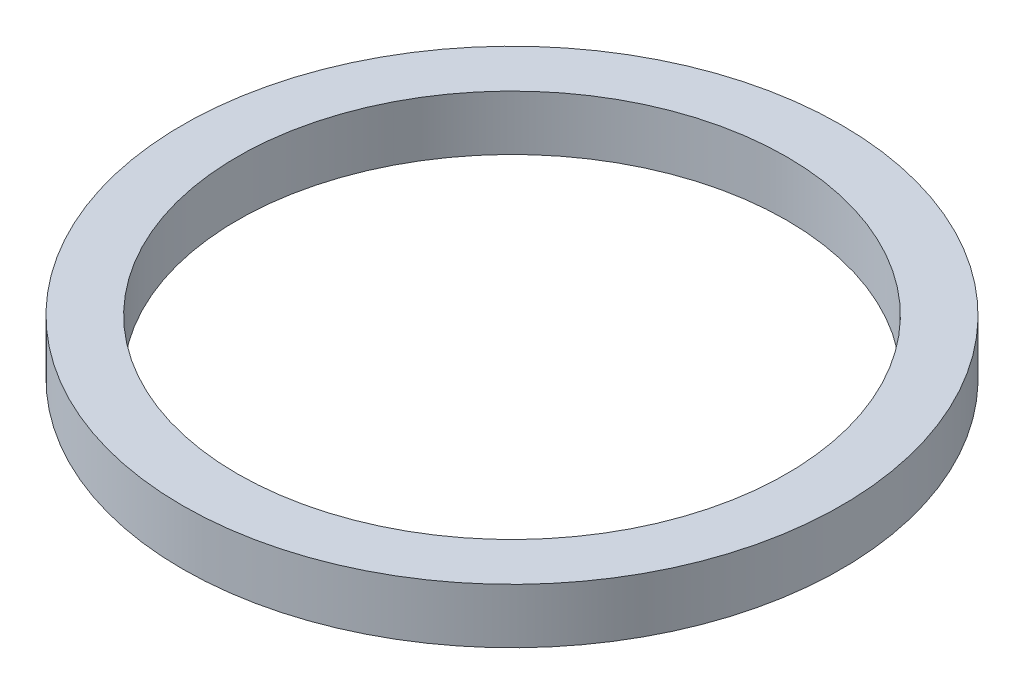
ISO-10303-21;
HEADER;
FILE_DESCRIPTION(('STEP AP214'),'2;1');
FILE_NAME('part.step','',(''),(''),'','','');
FILE_SCHEMA(('AUTOMOTIVE_DESIGN { 1 0 10303 214 1 1 1 1 }'));
ENDSEC;
DATA;
#1=APPLICATION_CONTEXT('core data for automotive mechanical design processes');
#2=APPLICATION_PROTOCOL_DEFINITION('international standard','automotive_design',2000,#1);
#3=PRODUCT_CONTEXT('',#1,'mechanical');
#4=PRODUCT('Part','Part','',(#3));
#5=PRODUCT_RELATED_PRODUCT_CATEGORY('part','',(#4));
#6=PRODUCT_DEFINITION_FORMATION('','',#4);
#7=PRODUCT_DEFINITION_CONTEXT('part definition',#1,'design');
#8=PRODUCT_DEFINITION('design','',#6,#7);
#9=PRODUCT_DEFINITION_SHAPE('','',#8);
#10=(LENGTH_UNIT() NAMED_UNIT(*) SI_UNIT(.MILLI.,.METRE.));
#11=(NAMED_UNIT(*) PLANE_ANGLE_UNIT() SI_UNIT($,.RADIAN.));
#12=(NAMED_UNIT(*) SI_UNIT($,.STERADIAN.) SOLID_ANGLE_UNIT());
#13=UNCERTAINTY_MEASURE_WITH_UNIT(LENGTH_MEASURE(1.E-05),#10,'distance_accuracy_value','');
#14=(GEOMETRIC_REPRESENTATION_CONTEXT(3) GLOBAL_UNCERTAINTY_ASSIGNED_CONTEXT((#13)) GLOBAL_UNIT_ASSIGNED_CONTEXT((#10,
#11,#12)) REPRESENTATION_CONTEXT('',''));
#15=CARTESIAN_POINT('',(0.,0.,0.));
#16=DIRECTION('',(0.,0.,1.));
#17=DIRECTION('',(1.,0.,0.));
#18=AXIS2_PLACEMENT_3D('',#15,#16,#17);
#19=CARTESIAN_POINT('',(-59.6665809094168,0.4,-25.7617495737929));
#20=DIRECTION('',(0.,1.,0.));
#21=DIRECTION('',(0.,0.,1.));
#22=AXIS2_PLACEMENT_3D('',#19,#20,#21);
#23=PLANE('',#22);
#24=CARTESIAN_POINT('',(-59.6665809094168,0.4,-25.7617495737929));
#25=DIRECTION('',(0.,1.,0.));
#26=DIRECTION('',(0.,0.,1.));
#27=AXIS2_PLACEMENT_3D('',#24,#25,#26);
#28=CIRCLE('',#27,2.4);
#29=CARTESIAN_POINT('',(-59.6665809094168,0.4,-23.3617495737929));
#30=VERTEX_POINT('',#29);
#31=EDGE_CURVE('E11',#30,#30,#28,.T.);
#32=ORIENTED_EDGE('',*,*,#31,.T.);
#33=EDGE_LOOP('',(#32));
#34=FACE_BOUND('',#33,.T.);
#35=CARTESIAN_POINT('',(-59.6665809094168,0.4,-25.7617495737929));
#36=DIRECTION('',(0.,1.,0.));
#37=DIRECTION('',(0.,0.,1.));
#38=AXIS2_PLACEMENT_3D('',#35,#36,#37);
#39=CIRCLE('',#38,2.);
#40=CARTESIAN_POINT('',(-59.6665809094168,0.4,-23.7617495737929));
#41=VERTEX_POINT('',#40);
#42=EDGE_CURVE('E56',#41,#41,#39,.T.);
#43=ORIENTED_EDGE('',*,*,#42,.F.);
#44=EDGE_LOOP('',(#43));
#45=FACE_BOUND('',#44,.T.);
#46=ADVANCED_FACE('F43',(#34,#45),#23,.T.);
#47=CARTESIAN_POINT('',(-59.6665809094168,0.,-25.7617495737929));
#48=DIRECTION('',(0.,1.,0.));
#49=DIRECTION('',(0.,0.,1.));
#50=AXIS2_PLACEMENT_3D('',#47,#48,#49);
#51=PLANE('',#50);
#52=CARTESIAN_POINT('',(-59.6665809094168,0.,-25.7617495737929));
#53=DIRECTION('',(0.,1.,0.));
#54=DIRECTION('',(0.,0.,1.));
#55=AXIS2_PLACEMENT_3D('',#52,#53,#54);
#56=CIRCLE('',#55,2.4);
#57=CARTESIAN_POINT('',(-59.6665809094168,0.,-23.3617495737929));
#58=VERTEX_POINT('',#57);
#59=EDGE_CURVE('E47',#58,#58,#56,.T.);
#60=ORIENTED_EDGE('',*,*,#59,.F.);
#61=EDGE_LOOP('',(#60));
#62=FACE_BOUND('',#61,.T.);
#63=CARTESIAN_POINT('',(-59.6665809094168,0.,-25.7617495737929));
#64=DIRECTION('',(0.,1.,0.));
#65=DIRECTION('',(0.,0.,1.));
#66=AXIS2_PLACEMENT_3D('',#63,#64,#65);
#67=CIRCLE('',#66,2.);
#68=CARTESIAN_POINT('',(-59.6665809094168,0.,-23.7617495737929));
#69=VERTEX_POINT('',#68);
#70=EDGE_CURVE('E58',#69,#69,#67,.T.);
#71=ORIENTED_EDGE('',*,*,#70,.T.);
#72=EDGE_LOOP('',(#71));
#73=FACE_BOUND('',#72,.T.);
#74=ADVANCED_FACE('F70',(#62,#73),#51,.F.);
#75=CARTESIAN_POINT('',(-59.6665809094168,0.4,-25.7617495737929));
#76=DIRECTION('',(0.,-1.,0.));
#77=DIRECTION('',(0.,0.,-1.));
#78=AXIS2_PLACEMENT_3D('',#75,#76,#77);
#79=CYLINDRICAL_SURFACE('',#78,2.4);
#80=ORIENTED_EDGE('',*,*,#31,.F.);
#81=EDGE_LOOP('',(#80));
#82=FACE_BOUND('',#81,.T.);
#83=ORIENTED_EDGE('',*,*,#59,.T.);
#84=EDGE_LOOP('',(#83));
#85=FACE_BOUND('',#84,.T.);
#86=ADVANCED_FACE('F45',(#82,#85),#79,.T.);
#87=CARTESIAN_POINT('',(-59.6665809094168,0.4,-25.7617495737929));
#88=DIRECTION('',(0.,-1.,0.));
#89=DIRECTION('',(0.,0.,-1.));
#90=AXIS2_PLACEMENT_3D('',#87,#88,#89);
#91=CYLINDRICAL_SURFACE('',#90,2.);
#92=ORIENTED_EDGE('',*,*,#42,.T.);
#93=EDGE_LOOP('',(#92));
#94=FACE_BOUND('',#93,.T.);
#95=ORIENTED_EDGE('',*,*,#70,.F.);
#96=EDGE_LOOP('',(#95));
#97=FACE_BOUND('',#96,.T.);
#98=ADVANCED_FACE('F66',(#94,#97),#91,.F.);
#99=CLOSED_SHELL('',(#46,#74,#86,#98));
#100=MANIFOLD_SOLID_BREP('B2',#99);
#101=ADVANCED_BREP_SHAPE_REPRESENTATION('',(#18,#100),#14);
#102=SHAPE_DEFINITION_REPRESENTATION(#9,#101);
ENDSEC;
END-ISO-10303-21;
